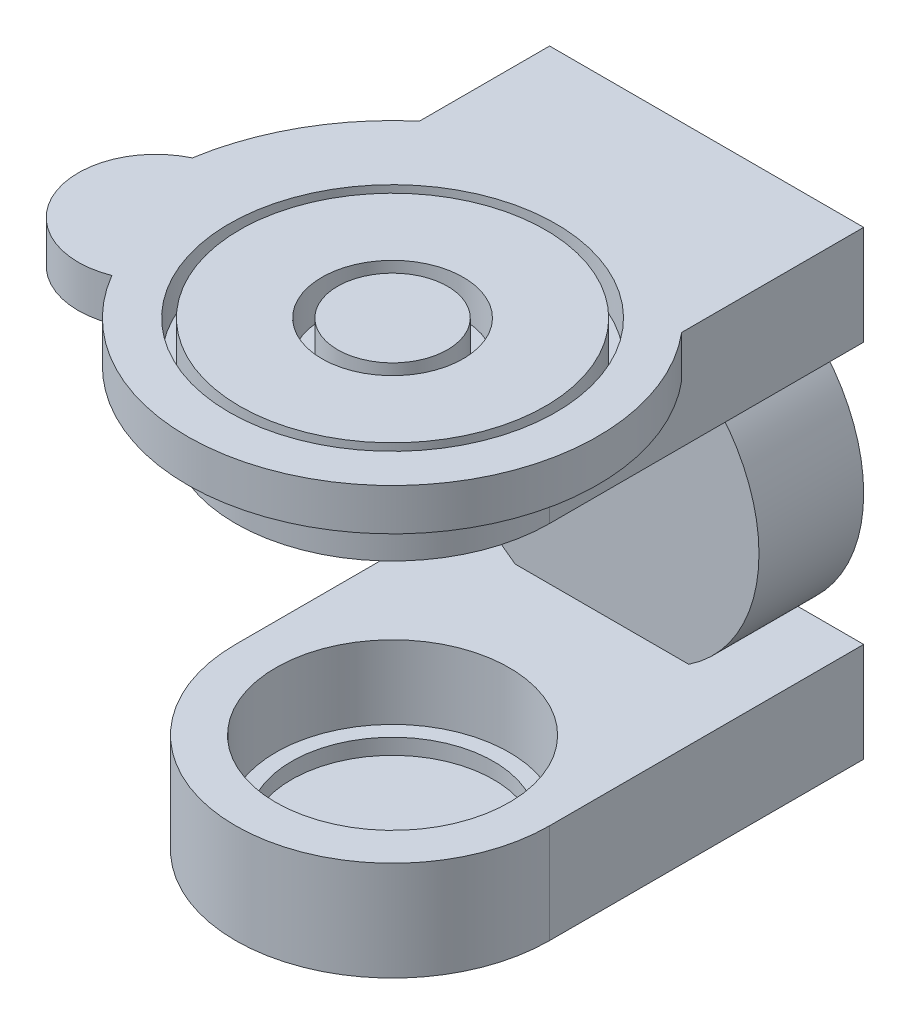
ISO-10303-21;
HEADER;
FILE_DESCRIPTION(('STEP AP214'),'2;1');
FILE_NAME('part.step','',(''),(''),'','','');
FILE_SCHEMA(('AUTOMOTIVE_DESIGN { 1 0 10303 214 1 1 1 1 }'));
ENDSEC;
DATA;
#1=APPLICATION_CONTEXT('core data for automotive mechanical design processes');
#2=APPLICATION_PROTOCOL_DEFINITION('international standard','automotive_design',2000,#1);
#3=PRODUCT_CONTEXT('',#1,'mechanical');
#4=PRODUCT('Part','Part','',(#3));
#5=PRODUCT_RELATED_PRODUCT_CATEGORY('part','',(#4));
#6=PRODUCT_DEFINITION_FORMATION('','',#4);
#7=PRODUCT_DEFINITION_CONTEXT('part definition',#1,'design');
#8=PRODUCT_DEFINITION('design','',#6,#7);
#9=PRODUCT_DEFINITION_SHAPE('','',#8);
#10=(LENGTH_UNIT() NAMED_UNIT(*) SI_UNIT(.MILLI.,.METRE.));
#11=(NAMED_UNIT(*) PLANE_ANGLE_UNIT() SI_UNIT($,.RADIAN.));
#12=(NAMED_UNIT(*) SI_UNIT($,.STERADIAN.) SOLID_ANGLE_UNIT());
#13=UNCERTAINTY_MEASURE_WITH_UNIT(LENGTH_MEASURE(1.E-05),#10,'distance_accuracy_value','');
#14=(GEOMETRIC_REPRESENTATION_CONTEXT(3) GLOBAL_UNCERTAINTY_ASSIGNED_CONTEXT((#13)) GLOBAL_UNIT_ASSIGNED_CONTEXT((#10,
#11,#12)) REPRESENTATION_CONTEXT('',''));
#15=CARTESIAN_POINT('',(0.,0.,0.));
#16=DIRECTION('',(0.,0.,1.));
#17=DIRECTION('',(1.,0.,0.));
#18=AXIS2_PLACEMENT_3D('',#15,#16,#17);
#19=CARTESIAN_POINT('',(-15.,22.,0.));
#20=DIRECTION('',(1.,0.,0.));
#21=DIRECTION('',(0.,0.,-1.));
#22=AXIS2_PLACEMENT_3D('',#19,#20,#21);
#23=PLANE('',#22);
#24=DIRECTION('',(0.,1.,0.));
#25=VECTOR('',#24,1.);
#26=CARTESIAN_POINT('',(-15.,18.,12.4327008336503));
#27=LINE('',#26,#25);
#28=CARTESIAN_POINT('',(-15.,18.,12.4327008336503));
#29=VERTEX_POINT('',#28);
#30=CARTESIAN_POINT('',(-15.,22.,12.4327008336503));
#31=VERTEX_POINT('',#30);
#32=EDGE_CURVE('E211',#29,#31,#27,.T.);
#33=ORIENTED_EDGE('',*,*,#32,.T.);
#34=DIRECTION('',(0.,0.,1.));
#35=VECTOR('',#34,1.);
#36=CARTESIAN_POINT('',(-15.,22.,0.));
#37=LINE('',#36,#35);
#38=CARTESIAN_POINT('',(-15.,22.,0.));
#39=VERTEX_POINT('',#38);
#40=EDGE_CURVE('E251',#39,#31,#37,.T.);
#41=ORIENTED_EDGE('',*,*,#40,.F.);
#42=DIRECTION('',(0.,-1.,0.));
#43=VECTOR('',#42,1.);
#44=CARTESIAN_POINT('',(-15.,22.,0.));
#45=LINE('',#44,#43);
#46=CARTESIAN_POINT('',(-15.,12.5,0.));
#47=VERTEX_POINT('',#46);
#48=EDGE_CURVE('E263',#39,#47,#45,.T.);
#49=ORIENTED_EDGE('',*,*,#48,.T.);
#50=DIRECTION('',(0.,0.,1.));
#51=VECTOR('',#50,1.);
#52=CARTESIAN_POINT('',(-15.,12.5,0.));
#53=LINE('',#52,#51);
#54=CARTESIAN_POINT('',(-15.,12.5,30.));
#55=VERTEX_POINT('',#54);
#56=EDGE_CURVE('E239',#47,#55,#53,.T.);
#57=ORIENTED_EDGE('',*,*,#56,.T.);
#58=DIRECTION('',(0.,-1.,0.));
#59=VECTOR('',#58,1.);
#60=CARTESIAN_POINT('',(-15.,22.,30.));
#61=LINE('',#60,#59);
#62=CARTESIAN_POINT('',(-15.,18.,30.));
#63=VERTEX_POINT('',#62);
#64=EDGE_CURVE('E261',#63,#55,#61,.T.);
#65=ORIENTED_EDGE('',*,*,#64,.F.);
#66=DIRECTION('',(0.,0.,1.));
#67=VECTOR('',#66,1.);
#68=CARTESIAN_POINT('',(-15.,18.,0.));
#69=LINE('',#68,#67);
#70=EDGE_CURVE('E95',#29,#63,#69,.T.);
#71=ORIENTED_EDGE('',*,*,#70,.F.);
#72=EDGE_LOOP('',(#33,#41,#49,#57,#65,#71));
#73=FACE_BOUND('',#72,.T.);
#74=ADVANCED_FACE('F78',(#73),#23,.F.);
#75=CARTESIAN_POINT('',(0.,22.,30.));
#76=DIRECTION('',(0.,-1.,0.));
#77=DIRECTION('',(0.,0.,-1.));
#78=AXIS2_PLACEMENT_3D('',#75,#76,#77);
#79=CYLINDRICAL_SURFACE('',#78,15.);
#80=CARTESIAN_POINT('',(0.,18.,30.));
#81=DIRECTION('',(0.,1.,0.));
#82=DIRECTION('',(0.,0.,1.));
#83=AXIS2_PLACEMENT_3D('',#80,#81,#82);
#84=CIRCLE('',#83,15.);
#85=CARTESIAN_POINT('',(15.,18.,30.));
#86=VERTEX_POINT('',#85);
#87=EDGE_CURVE('E231',#63,#86,#84,.T.);
#88=ORIENTED_EDGE('',*,*,#87,.F.);
#89=ORIENTED_EDGE('',*,*,#64,.T.);
#90=CARTESIAN_POINT('',(0.,12.5,30.));
#91=DIRECTION('',(0.,-1.,0.));
#92=DIRECTION('',(0.,0.,-1.));
#93=AXIS2_PLACEMENT_3D('',#90,#91,#92);
#94=CIRCLE('',#93,15.);
#95=CARTESIAN_POINT('',(15.,12.5,30.));
#96=VERTEX_POINT('',#95);
#97=EDGE_CURVE('E242',#55,#96,#94,.F.);
#98=ORIENTED_EDGE('',*,*,#97,.T.);
#99=DIRECTION('',(0.,-1.,0.));
#100=VECTOR('',#99,1.);
#101=CARTESIAN_POINT('',(15.,22.,30.));
#102=LINE('',#101,#100);
#103=EDGE_CURVE('E259',#86,#96,#102,.T.);
#104=ORIENTED_EDGE('',*,*,#103,.F.);
#105=EDGE_LOOP('',(#88,#89,#98,#104));
#106=FACE_BOUND('',#105,.T.);
#107=ADVANCED_FACE('F374',(#106),#79,.T.);
#108=CARTESIAN_POINT('',(15.,22.,0.));
#109=DIRECTION('',(1.,0.,0.));
#110=DIRECTION('',(0.,0.,-1.));
#111=AXIS2_PLACEMENT_3D('',#108,#109,#110);
#112=PLANE('',#111);
#113=DIRECTION('',(0.,0.,1.));
#114=VECTOR('',#113,1.);
#115=CARTESIAN_POINT('',(15.,22.,0.));
#116=LINE('',#115,#114);
#117=CARTESIAN_POINT('',(15.,22.,0.));
#118=VERTEX_POINT('',#117);
#119=CARTESIAN_POINT('',(15.,22.,17.3841369696719));
#120=VERTEX_POINT('',#119);
#121=EDGE_CURVE('E254',#118,#120,#116,.T.);
#122=ORIENTED_EDGE('',*,*,#121,.T.);
#123=DIRECTION('',(0.,1.,0.));
#124=VECTOR('',#123,1.);
#125=CARTESIAN_POINT('',(15.,18.,17.3841369696719));
#126=LINE('',#125,#124);
#127=CARTESIAN_POINT('',(15.,18.,17.3841369696719));
#128=VERTEX_POINT('',#127);
#129=EDGE_CURVE('E201',#128,#120,#126,.T.);
#130=ORIENTED_EDGE('',*,*,#129,.F.);
#131=DIRECTION('',(0.,0.,1.));
#132=VECTOR('',#131,1.);
#133=CARTESIAN_POINT('',(15.,18.,0.));
#134=LINE('',#133,#132);
#135=EDGE_CURVE('E229',#128,#86,#134,.T.);
#136=ORIENTED_EDGE('',*,*,#135,.T.);
#137=ORIENTED_EDGE('',*,*,#103,.T.);
#138=DIRECTION('',(0.,0.,1.));
#139=VECTOR('',#138,1.);
#140=CARTESIAN_POINT('',(15.,12.5,0.));
#141=LINE('',#140,#139);
#142=CARTESIAN_POINT('',(15.,12.5,0.));
#143=VERTEX_POINT('',#142);
#144=EDGE_CURVE('E245',#143,#96,#141,.T.);
#145=ORIENTED_EDGE('',*,*,#144,.F.);
#146=DIRECTION('',(0.,-1.,0.));
#147=VECTOR('',#146,1.);
#148=CARTESIAN_POINT('',(15.,22.,0.));
#149=LINE('',#148,#147);
#150=EDGE_CURVE('E256',#118,#143,#149,.T.);
#151=ORIENTED_EDGE('',*,*,#150,.F.);
#152=EDGE_LOOP('',(#122,#130,#136,#137,#145,#151));
#153=FACE_BOUND('',#152,.T.);
#154=ADVANCED_FACE('F379',(#153),#112,.T.);
#155=CARTESIAN_POINT('',(0.,19.5,30.));
#156=DIRECTION('',(0.,-1.,0.));
#157=DIRECTION('',(0.,0.,-1.));
#158=AXIS2_PLACEMENT_3D('',#155,#156,#157);
#159=CYLINDRICAL_SURFACE('',#158,11.15);
#160=CARTESIAN_POINT('',(0.,12.5,30.));
#161=DIRECTION('',(0.,1.,0.));
#162=DIRECTION('',(0.,0.,1.));
#163=AXIS2_PLACEMENT_3D('',#160,#161,#162);
#164=CIRCLE('',#163,11.15);
#165=CARTESIAN_POINT('',(0.,12.5,41.15));
#166=VERTEX_POINT('',#165);
#167=EDGE_CURVE('E233',#166,#166,#164,.T.);
#168=ORIENTED_EDGE('',*,*,#167,.F.);
#169=EDGE_LOOP('',(#168));
#170=FACE_BOUND('',#169,.T.);
#171=CARTESIAN_POINT('',(0.,18.,30.));
#172=DIRECTION('',(0.,1.,0.));
#173=DIRECTION('',(0.,0.,1.));
#174=AXIS2_PLACEMENT_3D('',#171,#172,#173);
#175=CIRCLE('',#174,11.15);
#176=CARTESIAN_POINT('',(0.,18.,41.15));
#177=VERTEX_POINT('',#176);
#178=EDGE_CURVE('E82',#177,#177,#175,.T.);
#179=ORIENTED_EDGE('',*,*,#178,.T.);
#180=EDGE_LOOP('',(#179));
#181=FACE_BOUND('',#180,.T.);
#182=ADVANCED_FACE('F656',(#170,#181),#159,.F.);
#183=CARTESIAN_POINT('',(0.,0.,10.));
#184=DIRECTION('',(0.,0.,-1.));
#185=DIRECTION('',(-1.,0.,0.));
#186=AXIS2_PLACEMENT_3D('',#183,#184,#185);
#187=CYLINDRICAL_SURFACE('',#186,15.);
#188=DIRECTION('',(0.,0.,-1.));
#189=VECTOR('',#188,1.);
#190=CARTESIAN_POINT('',(8.2915619758885,12.5,10.));
#191=LINE('',#190,#189);
#192=CARTESIAN_POINT('',(8.2915619758885,12.5,10.));
#193=VERTEX_POINT('',#192);
#194=CARTESIAN_POINT('',(8.2915619758885,12.5,0.));
#195=VERTEX_POINT('',#194);
#196=EDGE_CURVE('E270',#193,#195,#191,.T.);
#197=ORIENTED_EDGE('',*,*,#196,.F.);
#198=CARTESIAN_POINT('',(0.,0.,10.));
#199=DIRECTION('',(0.,0.,1.));
#200=DIRECTION('',(1.,0.,0.));
#201=AXIS2_PLACEMENT_3D('',#198,#199,#200);
#202=CIRCLE('',#201,15.);
#203=CARTESIAN_POINT('',(8.2915619758885,-12.5,10.));
#204=VERTEX_POINT('',#203);
#205=EDGE_CURVE('E12',#204,#193,#202,.T.);
#206=ORIENTED_EDGE('',*,*,#205,.F.);
#207=DIRECTION('',(0.,0.,-1.));
#208=VECTOR('',#207,1.);
#209=CARTESIAN_POINT('',(8.2915619758885,-12.5,10.));
#210=LINE('',#209,#208);
#211=CARTESIAN_POINT('',(8.2915619758885,-12.5,0.));
#212=VERTEX_POINT('',#211);
#213=EDGE_CURVE('E320',#212,#204,#210,.F.);
#214=ORIENTED_EDGE('',*,*,#213,.F.);
#215=CARTESIAN_POINT('',(0.,0.,0.));
#216=DIRECTION('',(0.,0.,1.));
#217=DIRECTION('',(1.,0.,0.));
#218=AXIS2_PLACEMENT_3D('',#215,#216,#217);
#219=CIRCLE('',#218,15.);
#220=EDGE_CURVE('E325',#212,#195,#219,.T.);
#221=ORIENTED_EDGE('',*,*,#220,.T.);
#222=EDGE_LOOP('',(#197,#206,#214,#221));
#223=FACE_BOUND('',#222,.T.);
#224=ADVANCED_FACE('F80',(#223),#187,.T.);
#225=DIRECTION('',(0.,0.,-1.));
#226=VECTOR('',#225,1.);
#227=CARTESIAN_POINT('',(-8.2915619758885,12.5,10.));
#228=LINE('',#227,#226);
#229=CARTESIAN_POINT('',(-8.2915619758885,12.5,0.));
#230=VERTEX_POINT('',#229);
#231=CARTESIAN_POINT('',(-8.2915619758885,12.5,10.));
#232=VERTEX_POINT('',#231);
#233=EDGE_CURVE('E268',#230,#232,#228,.F.);
#234=ORIENTED_EDGE('',*,*,#233,.F.);
#235=CARTESIAN_POINT('',(-8.2915619758885,-12.5,0.));
#236=VERTEX_POINT('',#235);
#237=EDGE_CURVE('E324',#230,#236,#219,.T.);
#238=ORIENTED_EDGE('',*,*,#237,.T.);
#239=DIRECTION('',(0.,0.,-1.));
#240=VECTOR('',#239,1.);
#241=CARTESIAN_POINT('',(-8.2915619758885,-12.5,10.));
#242=LINE('',#241,#240);
#243=CARTESIAN_POINT('',(-8.2915619758885,-12.5,10.));
#244=VERTEX_POINT('',#243);
#245=EDGE_CURVE('E322',#244,#236,#242,.T.);
#246=ORIENTED_EDGE('',*,*,#245,.F.);
#247=EDGE_CURVE('E87',#232,#244,#202,.T.);
#248=ORIENTED_EDGE('',*,*,#247,.F.);
#249=EDGE_LOOP('',(#234,#238,#246,#248));
#250=FACE_BOUND('',#249,.T.);
#251=ADVANCED_FACE('F335',(#250),#187,.T.);
#252=CARTESIAN_POINT('',(0.,0.,10.));
#253=DIRECTION('',(0.,0.,1.));
#254=DIRECTION('',(1.,0.,0.));
#255=AXIS2_PLACEMENT_3D('',#252,#253,#254);
#256=PLANE('',#255);
#257=ORIENTED_EDGE('',*,*,#205,.T.);
#258=DIRECTION('',(-1.,0.,0.));
#259=VECTOR('',#258,1.);
#260=CARTESIAN_POINT('',(0.,12.5,10.));
#261=LINE('',#260,#259);
#262=EDGE_CURVE('E265',#193,#232,#261,.T.);
#263=ORIENTED_EDGE('',*,*,#262,.T.);
#264=ORIENTED_EDGE('',*,*,#247,.T.);
#265=DIRECTION('',(1.,0.,0.));
#266=VECTOR('',#265,1.);
#267=CARTESIAN_POINT('',(0.,-12.5,10.));
#268=LINE('',#267,#266);
#269=EDGE_CURVE('E317',#244,#204,#268,.T.);
#270=ORIENTED_EDGE('',*,*,#269,.T.);
#271=EDGE_LOOP('',(#257,#263,#264,#270));
#272=FACE_BOUND('',#271,.T.);
#273=ADVANCED_FACE('F365',(#272),#256,.T.);
#274=CARTESIAN_POINT('',(0.,0.,0.));
#275=DIRECTION('',(0.,0.,1.));
#276=DIRECTION('',(1.,0.,0.));
#277=AXIS2_PLACEMENT_3D('',#274,#275,#276);
#278=PLANE('',#277);
#279=ORIENTED_EDGE('',*,*,#237,.F.);
#280=DIRECTION('',(1.,0.,0.));
#281=VECTOR('',#280,1.);
#282=CARTESIAN_POINT('',(0.,12.5,0.));
#283=LINE('',#282,#281);
#284=EDGE_CURVE('E237',#47,#230,#283,.T.);
#285=ORIENTED_EDGE('',*,*,#284,.F.);
#286=ORIENTED_EDGE('',*,*,#48,.F.);
#287=DIRECTION('',(1.,0.,0.));
#288=VECTOR('',#287,1.);
#289=CARTESIAN_POINT('',(0.,22.,0.));
#290=LINE('',#289,#288);
#291=EDGE_CURVE('E248',#39,#118,#290,.T.);
#292=ORIENTED_EDGE('',*,*,#291,.T.);
#293=ORIENTED_EDGE('',*,*,#150,.T.);
#294=EDGE_CURVE('E236',#195,#143,#283,.T.);
#295=ORIENTED_EDGE('',*,*,#294,.F.);
#296=ORIENTED_EDGE('',*,*,#220,.F.);
#297=DIRECTION('',(1.,0.,0.));
#298=VECTOR('',#297,1.);
#299=CARTESIAN_POINT('',(0.,-12.5,0.));
#300=LINE('',#299,#298);
#301=CARTESIAN_POINT('',(15.,-12.5,0.));
#302=VERTEX_POINT('',#301);
#303=EDGE_CURVE('E284',#212,#302,#300,.T.);
#304=ORIENTED_EDGE('',*,*,#303,.T.);
#305=DIRECTION('',(0.,1.,0.));
#306=VECTOR('',#305,1.);
#307=CARTESIAN_POINT('',(15.,-22.,0.));
#308=LINE('',#307,#306);
#309=CARTESIAN_POINT('',(15.,-22.,0.));
#310=VERTEX_POINT('',#309);
#311=EDGE_CURVE('E314',#310,#302,#308,.T.);
#312=ORIENTED_EDGE('',*,*,#311,.F.);
#313=DIRECTION('',(1.,0.,0.));
#314=VECTOR('',#313,1.);
#315=CARTESIAN_POINT('',(0.,-22.,0.));
#316=LINE('',#315,#314);
#317=CARTESIAN_POINT('',(-15.,-22.,0.));
#318=VERTEX_POINT('',#317);
#319=EDGE_CURVE('E297',#318,#310,#316,.T.);
#320=ORIENTED_EDGE('',*,*,#319,.F.);
#321=DIRECTION('',(0.,1.,0.));
#322=VECTOR('',#321,1.);
#323=CARTESIAN_POINT('',(-15.,-22.,0.));
#324=LINE('',#323,#322);
#325=CARTESIAN_POINT('',(-15.,-12.5,0.));
#326=VERTEX_POINT('',#325);
#327=EDGE_CURVE('E308',#318,#326,#324,.T.);
#328=ORIENTED_EDGE('',*,*,#327,.T.);
#329=EDGE_CURVE('E285',#326,#236,#300,.T.);
#330=ORIENTED_EDGE('',*,*,#329,.T.);
#331=EDGE_LOOP('',(#279,#285,#286,#292,#293,#295,#296,#304,#312,#320,#328,#330));
#332=FACE_BOUND('',#331,.T.);
#333=ADVANCED_FACE('F343',(#332),#278,.F.);
#334=CARTESIAN_POINT('',(0.,-12.5,0.));
#335=DIRECTION('',(0.,-1.,0.));
#336=DIRECTION('',(0.,0.,-1.));
#337=AXIS2_PLACEMENT_3D('',#334,#335,#336);
#338=PLANE('',#337);
#339=CARTESIAN_POINT('',(0.,-12.5,30.));
#340=DIRECTION('',(0.,1.,0.));
#341=DIRECTION('',(0.,0.,1.));
#342=AXIS2_PLACEMENT_3D('',#339,#340,#341);
#343=CIRCLE('',#342,11.15);
#344=CARTESIAN_POINT('',(0.,-12.5,41.15));
#345=VERTEX_POINT('',#344);
#346=EDGE_CURVE('E272',#345,#345,#343,.T.);
#347=ORIENTED_EDGE('',*,*,#346,.F.);
#348=EDGE_LOOP('',(#347));
#349=FACE_BOUND('',#348,.T.);
#350=ORIENTED_EDGE('',*,*,#269,.F.);
#351=ORIENTED_EDGE('',*,*,#245,.T.);
#352=ORIENTED_EDGE('',*,*,#329,.F.);
#353=DIRECTION('',(0.,0.,1.));
#354=VECTOR('',#353,1.);
#355=CARTESIAN_POINT('',(-15.,-12.5,0.));
#356=LINE('',#355,#354);
#357=CARTESIAN_POINT('',(-15.,-12.5,30.));
#358=VERTEX_POINT('',#357);
#359=EDGE_CURVE('E294',#326,#358,#356,.T.);
#360=ORIENTED_EDGE('',*,*,#359,.T.);
#361=CARTESIAN_POINT('',(0.,-12.5,30.));
#362=DIRECTION('',(0.,-1.,0.));
#363=DIRECTION('',(0.,0.,-1.));
#364=AXIS2_PLACEMENT_3D('',#361,#362,#363);
#365=CIRCLE('',#364,15.);
#366=CARTESIAN_POINT('',(15.,-12.5,30.));
#367=VERTEX_POINT('',#366);
#368=EDGE_CURVE('E291',#358,#367,#365,.F.);
#369=ORIENTED_EDGE('',*,*,#368,.T.);
#370=DIRECTION('',(0.,0.,1.));
#371=VECTOR('',#370,1.);
#372=CARTESIAN_POINT('',(15.,-12.5,0.));
#373=LINE('',#372,#371);
#374=EDGE_CURVE('E288',#302,#367,#373,.T.);
#375=ORIENTED_EDGE('',*,*,#374,.F.);
#376=ORIENTED_EDGE('',*,*,#303,.F.);
#377=ORIENTED_EDGE('',*,*,#213,.T.);
#378=EDGE_LOOP('',(#350,#351,#352,#360,#369,#375,#376,#377));
#379=FACE_BOUND('',#378,.T.);
#380=ADVANCED_FACE('F342',(#349,#379),#338,.F.);
#381=CARTESIAN_POINT('',(15.,-22.,0.));
#382=DIRECTION('',(-1.,0.,0.));
#383=DIRECTION('',(0.,0.,1.));
#384=AXIS2_PLACEMENT_3D('',#381,#382,#383);
#385=PLANE('',#384);
#386=ORIENTED_EDGE('',*,*,#311,.T.);
#387=ORIENTED_EDGE('',*,*,#374,.T.);
#388=DIRECTION('',(0.,1.,0.));
#389=VECTOR('',#388,1.);
#390=CARTESIAN_POINT('',(15.,-22.,30.));
#391=LINE('',#390,#389);
#392=CARTESIAN_POINT('',(15.,-22.,30.));
#393=VERTEX_POINT('',#392);
#394=EDGE_CURVE('E312',#393,#367,#391,.T.);
#395=ORIENTED_EDGE('',*,*,#394,.F.);
#396=DIRECTION('',(0.,0.,1.));
#397=VECTOR('',#396,1.);
#398=CARTESIAN_POINT('',(15.,-22.,0.));
#399=LINE('',#398,#397);
#400=EDGE_CURVE('E300',#310,#393,#399,.T.);
#401=ORIENTED_EDGE('',*,*,#400,.F.);
#402=EDGE_LOOP('',(#386,#387,#395,#401));
#403=FACE_BOUND('',#402,.T.);
#404=ADVANCED_FACE('F357',(#403),#385,.F.);
#405=CARTESIAN_POINT('',(0.,-22.,30.));
#406=DIRECTION('',(0.,1.,0.));
#407=DIRECTION('',(0.,0.,1.));
#408=AXIS2_PLACEMENT_3D('',#405,#406,#407);
#409=CYLINDRICAL_SURFACE('',#408,15.);
#410=ORIENTED_EDGE('',*,*,#394,.T.);
#411=ORIENTED_EDGE('',*,*,#368,.F.);
#412=DIRECTION('',(0.,1.,0.));
#413=VECTOR('',#412,1.);
#414=CARTESIAN_POINT('',(-15.,-22.,30.));
#415=LINE('',#414,#413);
#416=CARTESIAN_POINT('',(-15.,-22.,30.));
#417=VERTEX_POINT('',#416);
#418=EDGE_CURVE('E310',#417,#358,#415,.T.);
#419=ORIENTED_EDGE('',*,*,#418,.F.);
#420=CARTESIAN_POINT('',(0.,-22.,30.));
#421=DIRECTION('',(0.,-1.,0.));
#422=DIRECTION('',(0.,0.,-1.));
#423=AXIS2_PLACEMENT_3D('',#420,#421,#422);
#424=CIRCLE('',#423,15.);
#425=EDGE_CURVE('E302',#417,#393,#424,.F.);
#426=ORIENTED_EDGE('',*,*,#425,.T.);
#427=EDGE_LOOP('',(#410,#411,#419,#426));
#428=FACE_BOUND('',#427,.T.);
#429=ADVANCED_FACE('F353',(#428),#409,.T.);
#430=CARTESIAN_POINT('',(-15.,-22.,0.));
#431=DIRECTION('',(-1.,0.,0.));
#432=DIRECTION('',(0.,0.,1.));
#433=AXIS2_PLACEMENT_3D('',#430,#431,#432);
#434=PLANE('',#433);
#435=ORIENTED_EDGE('',*,*,#418,.T.);
#436=ORIENTED_EDGE('',*,*,#359,.F.);
#437=ORIENTED_EDGE('',*,*,#327,.F.);
#438=DIRECTION('',(0.,0.,1.));
#439=VECTOR('',#438,1.);
#440=CARTESIAN_POINT('',(-15.,-22.,0.));
#441=LINE('',#440,#439);
#442=EDGE_CURVE('E305',#318,#417,#441,.T.);
#443=ORIENTED_EDGE('',*,*,#442,.T.);
#444=EDGE_LOOP('',(#435,#436,#437,#443));
#445=FACE_BOUND('',#444,.T.);
#446=ADVANCED_FACE('F349',(#445),#434,.T.);
#447=CARTESIAN_POINT('',(0.,-22.,0.));
#448=DIRECTION('',(0.,-1.,0.));
#449=DIRECTION('',(0.,0.,-1.));
#450=AXIS2_PLACEMENT_3D('',#447,#448,#449);
#451=PLANE('',#450);
#452=ORIENTED_EDGE('',*,*,#319,.T.);
#453=ORIENTED_EDGE('',*,*,#400,.T.);
#454=ORIENTED_EDGE('',*,*,#425,.F.);
#455=ORIENTED_EDGE('',*,*,#442,.F.);
#456=EDGE_LOOP('',(#452,#453,#454,#455));
#457=FACE_BOUND('',#456,.T.);
#458=ADVANCED_FACE('F392',(#457),#451,.T.);
#459=CARTESIAN_POINT('',(0.,-19.5,30.));
#460=DIRECTION('',(0.,1.,0.));
#461=DIRECTION('',(0.,0.,1.));
#462=AXIS2_PLACEMENT_3D('',#459,#460,#461);
#463=CYLINDRICAL_SURFACE('',#462,11.15);
#464=CARTESIAN_POINT('',(0.,-19.5,30.));
#465=DIRECTION('',(0.,1.,0.));
#466=DIRECTION('',(0.,0.,1.));
#467=AXIS2_PLACEMENT_3D('',#464,#465,#466);
#468=CIRCLE('',#467,11.15);
#469=CARTESIAN_POINT('',(0.,-19.5,41.15));
#470=VERTEX_POINT('',#469);
#471=EDGE_CURVE('E276',#470,#470,#468,.T.);
#472=ORIENTED_EDGE('',*,*,#471,.F.);
#473=EDGE_LOOP('',(#472));
#474=FACE_BOUND('',#473,.T.);
#475=ORIENTED_EDGE('',*,*,#346,.T.);
#476=EDGE_LOOP('',(#475));
#477=FACE_BOUND('',#476,.T.);
#478=ADVANCED_FACE('F388',(#474,#477),#463,.F.);
#479=CARTESIAN_POINT('',(0.,-19.5,0.));
#480=DIRECTION('',(0.,1.,0.));
#481=DIRECTION('',(0.,0.,1.));
#482=AXIS2_PLACEMENT_3D('',#479,#480,#481);
#483=PLANE('',#482);
#484=CARTESIAN_POINT('',(0.,-19.5,30.));
#485=DIRECTION('',(0.,1.,0.));
#486=DIRECTION('',(0.,0.,1.));
#487=AXIS2_PLACEMENT_3D('',#484,#485,#486);
#488=CIRCLE('',#487,9.65);
#489=CARTESIAN_POINT('',(0.,-19.5,39.65));
#490=VERTEX_POINT('',#489);
#491=EDGE_CURVE('E273',#490,#490,#488,.T.);
#492=ORIENTED_EDGE('',*,*,#491,.F.);
#493=EDGE_LOOP('',(#492));
#494=FACE_BOUND('',#493,.T.);
#495=ORIENTED_EDGE('',*,*,#471,.T.);
#496=EDGE_LOOP('',(#495));
#497=FACE_BOUND('',#496,.T.);
#498=ADVANCED_FACE('F384',(#494,#497),#483,.T.);
#499=CARTESIAN_POINT('',(0.,-21.,0.));
#500=DIRECTION('',(0.,1.,0.));
#501=DIRECTION('',(0.,0.,1.));
#502=AXIS2_PLACEMENT_3D('',#499,#500,#501);
#503=PLANE('',#502);
#504=CARTESIAN_POINT('',(0.,-21.,30.));
#505=DIRECTION('',(0.,1.,0.));
#506=DIRECTION('',(0.,0.,1.));
#507=AXIS2_PLACEMENT_3D('',#504,#505,#506);
#508=CIRCLE('',#507,9.65);
#509=CARTESIAN_POINT('',(0.,-21.,39.65));
#510=VERTEX_POINT('',#509);
#511=EDGE_CURVE('E279',#510,#510,#508,.T.);
#512=ORIENTED_EDGE('',*,*,#511,.T.);
#513=EDGE_LOOP('',(#512));
#514=FACE_BOUND('',#513,.T.);
#515=ADVANCED_FACE('F387',(#514),#503,.T.);
#516=CARTESIAN_POINT('',(0.,-21.,30.));
#517=DIRECTION('',(0.,1.,0.));
#518=DIRECTION('',(0.,0.,1.));
#519=AXIS2_PLACEMENT_3D('',#516,#517,#518);
#520=CYLINDRICAL_SURFACE('',#519,9.65);
#521=ORIENTED_EDGE('',*,*,#511,.F.);
#522=EDGE_LOOP('',(#521));
#523=FACE_BOUND('',#522,.T.);
#524=ORIENTED_EDGE('',*,*,#491,.T.);
#525=EDGE_LOOP('',(#524));
#526=FACE_BOUND('',#525,.T.);
#527=ADVANCED_FACE('F396',(#523,#526),#520,.F.);
#528=CARTESIAN_POINT('',(0.,12.5,0.));
#529=DIRECTION('',(0.,1.,0.));
#530=DIRECTION('',(0.,0.,-1.));
#531=AXIS2_PLACEMENT_3D('',#528,#529,#530);
#532=PLANE('',#531);
#533=ORIENTED_EDGE('',*,*,#167,.T.);
#534=EDGE_LOOP('',(#533));
#535=FACE_BOUND('',#534,.T.);
#536=ORIENTED_EDGE('',*,*,#262,.F.);
#537=ORIENTED_EDGE('',*,*,#196,.T.);
#538=ORIENTED_EDGE('',*,*,#294,.T.);
#539=ORIENTED_EDGE('',*,*,#144,.T.);
#540=ORIENTED_EDGE('',*,*,#97,.F.);
#541=ORIENTED_EDGE('',*,*,#56,.F.);
#542=ORIENTED_EDGE('',*,*,#284,.T.);
#543=ORIENTED_EDGE('',*,*,#233,.T.);
#544=EDGE_LOOP('',(#536,#537,#538,#539,#540,#541,#542,#543));
#545=FACE_BOUND('',#544,.T.);
#546=ADVANCED_FACE('F362',(#535,#545),#532,.F.);
#547=CARTESIAN_POINT('',(0.,22.,0.));
#548=DIRECTION('',(0.,1.,0.));
#549=DIRECTION('',(0.,0.,-1.));
#550=AXIS2_PLACEMENT_3D('',#547,#548,#549);
#551=PLANE('',#550);
#552=CARTESIAN_POINT('',(0.,22.,30.));
#553=DIRECTION('',(0.,1.,0.));
#554=DIRECTION('',(0.,0.,1.));
#555=AXIS2_PLACEMENT_3D('',#552,#553,#554);
#556=CIRCLE('',#555,15.6);
#557=CARTESIAN_POINT('',(0.,22.,45.6));
#558=VERTEX_POINT('',#557);
#559=EDGE_CURVE('E757',#558,#558,#556,.T.);
#560=ORIENTED_EDGE('',*,*,#559,.F.);
#561=EDGE_LOOP('',(#560));
#562=FACE_BOUND('',#561,.T.);
#563=ORIENTED_EDGE('',*,*,#40,.T.);
#564=CARTESIAN_POINT('',(3.05311331771918E-13,22.,29.9999999999998));
#565=DIRECTION('',(0.,1.,0.));
#566=DIRECTION('',(0.,0.,1.));
#567=AXIS2_PLACEMENT_3D('',#564,#565,#566);
#568=CIRCLE('',#567,23.1000000000007);
#569=CARTESIAN_POINT('',(-22.8049107583976,22.,26.3195047477896));
#570=VERTEX_POINT('',#569);
#571=EDGE_CURVE('E221',#570,#31,#568,.F.);
#572=ORIENTED_EDGE('',*,*,#571,.F.);
#573=CARTESIAN_POINT('',(-19.621990215063,22.,33.0000000000009));
#574=DIRECTION('',(0.,1.,0.));
#575=DIRECTION('',(0.,0.,1.));
#576=AXIS2_PLACEMENT_3D('',#573,#574,#575);
#577=CIRCLE('',#576,7.39999999999997);
#578=CARTESIAN_POINT('',(-16.9219219751436,22.,39.8898208612264));
#579=VERTEX_POINT('',#578);
#580=EDGE_CURVE('E206',#579,#570,#577,.F.);
#581=ORIENTED_EDGE('',*,*,#580,.F.);
#582=CARTESIAN_POINT('',(0.,22.,30.));
#583=DIRECTION('',(0.,1.,0.));
#584=DIRECTION('',(0.,0.,1.));
#585=AXIS2_PLACEMENT_3D('',#582,#583,#584);
#586=CIRCLE('',#585,19.6);
#587=EDGE_CURVE('E218',#120,#579,#586,.F.);
#588=ORIENTED_EDGE('',*,*,#587,.F.);
#589=ORIENTED_EDGE('',*,*,#121,.F.);
#590=ORIENTED_EDGE('',*,*,#291,.F.);
#591=EDGE_LOOP('',(#563,#572,#581,#588,#589,#590));
#592=FACE_BOUND('',#591,.T.);
#593=ADVANCED_FACE('F450',(#562,#592),#551,.T.);
#594=CARTESIAN_POINT('',(0.,18.,0.));
#595=DIRECTION('',(0.,1.,0.));
#596=DIRECTION('',(0.,0.,1.));
#597=AXIS2_PLACEMENT_3D('',#594,#595,#596);
#598=PLANE('',#597);
#599=ORIENTED_EDGE('',*,*,#178,.F.);
#600=EDGE_LOOP('',(#599));
#601=FACE_BOUND('',#600,.T.);
#602=ADVANCED_FACE('F459',(#601),#598,.F.);
#603=CARTESIAN_POINT('',(0.,18.,30.));
#604=DIRECTION('',(0.,1.,0.));
#605=DIRECTION('',(0.,0.,1.));
#606=AXIS2_PLACEMENT_3D('',#603,#604,#605);
#607=CYLINDRICAL_SURFACE('',#606,19.6);
#608=ORIENTED_EDGE('',*,*,#587,.T.);
#609=DIRECTION('',(0.,1.,0.));
#610=VECTOR('',#609,1.);
#611=CARTESIAN_POINT('',(-16.9219219751436,18.,39.8898208612264));
#612=LINE('',#611,#610);
#613=CARTESIAN_POINT('',(-16.9219219751436,18.,39.8898208612264));
#614=VERTEX_POINT('',#613);
#615=EDGE_CURVE('E210',#614,#579,#612,.T.);
#616=ORIENTED_EDGE('',*,*,#615,.F.);
#617=CARTESIAN_POINT('',(0.,18.,30.));
#618=DIRECTION('',(0.,1.,0.));
#619=DIRECTION('',(0.,0.,1.));
#620=AXIS2_PLACEMENT_3D('',#617,#618,#619);
#621=CIRCLE('',#620,19.6);
#622=EDGE_CURVE('E197',#128,#614,#621,.F.);
#623=ORIENTED_EDGE('',*,*,#622,.F.);
#624=ORIENTED_EDGE('',*,*,#129,.T.);
#625=EDGE_LOOP('',(#608,#616,#623,#624));
#626=FACE_BOUND('',#625,.T.);
#627=ADVANCED_FACE('F471',(#626),#607,.T.);
#628=CARTESIAN_POINT('',(-19.621990215063,18.,33.0000000000009));
#629=DIRECTION('',(0.,1.,0.));
#630=DIRECTION('',(0.,0.,1.));
#631=AXIS2_PLACEMENT_3D('',#628,#629,#630);
#632=CYLINDRICAL_SURFACE('',#631,7.39999999999997);
#633=ORIENTED_EDGE('',*,*,#580,.T.);
#634=DIRECTION('',(0.,1.,0.));
#635=VECTOR('',#634,1.);
#636=CARTESIAN_POINT('',(-22.8049107583976,18.,26.3195047477896));
#637=LINE('',#636,#635);
#638=CARTESIAN_POINT('',(-22.8049107583976,18.,26.3195047477896));
#639=VERTEX_POINT('',#638);
#640=EDGE_CURVE('E204',#639,#570,#637,.T.);
#641=ORIENTED_EDGE('',*,*,#640,.F.);
#642=CARTESIAN_POINT('',(-19.621990215063,18.,33.0000000000009));
#643=DIRECTION('',(0.,1.,0.));
#644=DIRECTION('',(0.,0.,1.));
#645=AXIS2_PLACEMENT_3D('',#642,#643,#644);
#646=CIRCLE('',#645,7.39999999999997);
#647=EDGE_CURVE('E190',#614,#639,#646,.F.);
#648=ORIENTED_EDGE('',*,*,#647,.F.);
#649=ORIENTED_EDGE('',*,*,#615,.T.);
#650=EDGE_LOOP('',(#633,#641,#648,#649));
#651=FACE_BOUND('',#650,.T.);
#652=ADVANCED_FACE('F205',(#651),#632,.T.);
#653=CARTESIAN_POINT('',(3.05311331771918E-13,18.,29.9999999999998));
#654=DIRECTION('',(0.,1.,0.));
#655=DIRECTION('',(0.,0.,1.));
#656=AXIS2_PLACEMENT_3D('',#653,#654,#655);
#657=CYLINDRICAL_SURFACE('',#656,23.1000000000007);
#658=ORIENTED_EDGE('',*,*,#571,.T.);
#659=ORIENTED_EDGE('',*,*,#32,.F.);
#660=CARTESIAN_POINT('',(3.05311331771918E-13,18.,29.9999999999998));
#661=DIRECTION('',(0.,1.,0.));
#662=DIRECTION('',(0.,0.,1.));
#663=AXIS2_PLACEMENT_3D('',#660,#661,#662);
#664=CIRCLE('',#663,23.1000000000007);
#665=EDGE_CURVE('E194',#639,#29,#664,.F.);
#666=ORIENTED_EDGE('',*,*,#665,.F.);
#667=ORIENTED_EDGE('',*,*,#640,.T.);
#668=EDGE_LOOP('',(#658,#659,#666,#667));
#669=FACE_BOUND('',#668,.T.);
#670=ADVANCED_FACE('F213',(#669),#657,.T.);
#671=ORIENTED_EDGE('',*,*,#70,.T.);
#672=ORIENTED_EDGE('',*,*,#87,.T.);
#673=ORIENTED_EDGE('',*,*,#135,.F.);
#674=ORIENTED_EDGE('',*,*,#622,.T.);
#675=ORIENTED_EDGE('',*,*,#647,.T.);
#676=ORIENTED_EDGE('',*,*,#665,.T.);
#677=EDGE_LOOP('',(#671,#672,#673,#674,#675,#676));
#678=FACE_BOUND('',#677,.T.);
#679=ADVANCED_FACE('F192',(#678),#598,.F.);
#680=CARTESIAN_POINT('',(0.,18.5,30.));
#681=DIRECTION('',(0.,1.,0.));
#682=DIRECTION('',(0.,0.,1.));
#683=AXIS2_PLACEMENT_3D('',#680,#681,#682);
#684=CYLINDRICAL_SURFACE('',#683,15.6);
#685=CARTESIAN_POINT('',(0.,18.5,30.));
#686=DIRECTION('',(0.,1.,0.));
#687=DIRECTION('',(0.,0.,1.));
#688=AXIS2_PLACEMENT_3D('',#685,#686,#687);
#689=CIRCLE('',#688,15.6);
#690=CARTESIAN_POINT('',(0.,18.5,45.6));
#691=VERTEX_POINT('',#690);
#692=EDGE_CURVE('E756',#691,#691,#689,.T.);
#693=ORIENTED_EDGE('',*,*,#692,.F.);
#694=EDGE_LOOP('',(#693));
#695=FACE_BOUND('',#694,.T.);
#696=ORIENTED_EDGE('',*,*,#559,.T.);
#697=EDGE_LOOP('',(#696));
#698=FACE_BOUND('',#697,.T.);
#699=ADVANCED_FACE('F498',(#695,#698),#684,.F.);
#700=CARTESIAN_POINT('',(0.,18.5,30.));
#701=DIRECTION('',(0.,1.,0.));
#702=DIRECTION('',(0.,0.,1.));
#703=AXIS2_PLACEMENT_3D('',#700,#701,#702);
#704=CYLINDRICAL_SURFACE('',#703,14.6);
#705=CARTESIAN_POINT('',(0.,18.5,30.));
#706=DIRECTION('',(0.,1.,0.));
#707=DIRECTION('',(0.,0.,1.));
#708=AXIS2_PLACEMENT_3D('',#705,#706,#707);
#709=CIRCLE('',#708,14.6);
#710=CARTESIAN_POINT('',(0.,18.5,44.6));
#711=VERTEX_POINT('',#710);
#712=EDGE_CURVE('E222',#711,#711,#709,.T.);
#713=ORIENTED_EDGE('',*,*,#712,.T.);
#714=EDGE_LOOP('',(#713));
#715=FACE_BOUND('',#714,.T.);
#716=CARTESIAN_POINT('',(0.,22.,30.));
#717=DIRECTION('',(0.,1.,0.));
#718=DIRECTION('',(0.,0.,1.));
#719=AXIS2_PLACEMENT_3D('',#716,#717,#718);
#720=CIRCLE('',#719,14.6);
#721=CARTESIAN_POINT('',(0.,22.,44.6));
#722=VERTEX_POINT('',#721);
#723=EDGE_CURVE('E753',#722,#722,#720,.T.);
#724=ORIENTED_EDGE('',*,*,#723,.F.);
#725=EDGE_LOOP('',(#724));
#726=FACE_BOUND('',#725,.T.);
#727=ADVANCED_FACE('F503',(#715,#726),#704,.T.);
#728=CARTESIAN_POINT('',(0.,18.5,0.));
#729=DIRECTION('',(0.,1.,0.));
#730=DIRECTION('',(0.,0.,1.));
#731=AXIS2_PLACEMENT_3D('',#728,#729,#730);
#732=PLANE('',#731);
#733=ORIENTED_EDGE('',*,*,#692,.T.);
#734=EDGE_LOOP('',(#733));
#735=FACE_BOUND('',#734,.T.);
#736=ORIENTED_EDGE('',*,*,#712,.F.);
#737=EDGE_LOOP('',(#736));
#738=FACE_BOUND('',#737,.T.);
#739=ADVANCED_FACE('F511',(#735,#738),#732,.T.);
#740=CARTESIAN_POINT('',(0.,22.,30.));
#741=DIRECTION('',(0.,1.,0.));
#742=DIRECTION('',(0.,0.,1.));
#743=AXIS2_PLACEMENT_3D('',#740,#741,#742);
#744=CIRCLE('',#743,6.75);
#745=CARTESIAN_POINT('',(0.,22.,36.75));
#746=VERTEX_POINT('',#745);
#747=EDGE_CURVE('E765',#746,#746,#744,.T.);
#748=ORIENTED_EDGE('',*,*,#747,.F.);
#749=EDGE_LOOP('',(#748));
#750=FACE_BOUND('',#749,.T.);
#751=ORIENTED_EDGE('',*,*,#723,.T.);
#752=EDGE_LOOP('',(#751));
#753=FACE_BOUND('',#752,.T.);
#754=ADVANCED_FACE('F463',(#750,#753),#551,.T.);
#755=CARTESIAN_POINT('',(0.,18.5,30.));
#756=DIRECTION('',(0.,1.,0.));
#757=DIRECTION('',(0.,0.,1.));
#758=AXIS2_PLACEMENT_3D('',#755,#756,#757);
#759=CYLINDRICAL_SURFACE('',#758,5.25);
#760=CARTESIAN_POINT('',(0.,18.5,30.));
#761=DIRECTION('',(0.,1.,0.));
#762=DIRECTION('',(0.,0.,1.));
#763=AXIS2_PLACEMENT_3D('',#760,#761,#762);
#764=CIRCLE('',#763,5.25);
#765=CARTESIAN_POINT('',(0.,18.5,35.25));
#766=VERTEX_POINT('',#765);
#767=EDGE_CURVE('E768',#766,#766,#764,.T.);
#768=ORIENTED_EDGE('',*,*,#767,.T.);
#769=EDGE_LOOP('',(#768));
#770=FACE_BOUND('',#769,.T.);
#771=CARTESIAN_POINT('',(0.,22.,30.));
#772=DIRECTION('',(0.,1.,0.));
#773=DIRECTION('',(0.,0.,1.));
#774=AXIS2_PLACEMENT_3D('',#771,#772,#773);
#775=CIRCLE('',#774,5.25);
#776=CARTESIAN_POINT('',(0.,22.,35.25));
#777=VERTEX_POINT('',#776);
#778=EDGE_CURVE('E769',#777,#777,#775,.T.);
#779=ORIENTED_EDGE('',*,*,#778,.F.);
#780=EDGE_LOOP('',(#779));
#781=FACE_BOUND('',#780,.T.);
#782=ADVANCED_FACE('F526',(#770,#781),#759,.T.);
#783=CARTESIAN_POINT('',(0.,18.5,30.));
#784=DIRECTION('',(0.,1.,0.));
#785=DIRECTION('',(0.,0.,1.));
#786=AXIS2_PLACEMENT_3D('',#783,#784,#785);
#787=CYLINDRICAL_SURFACE('',#786,6.75);
#788=CARTESIAN_POINT('',(0.,18.5,30.));
#789=DIRECTION('',(0.,1.,0.));
#790=DIRECTION('',(0.,0.,1.));
#791=AXIS2_PLACEMENT_3D('',#788,#789,#790);
#792=CIRCLE('',#791,6.75);
#793=CARTESIAN_POINT('',(0.,18.5,36.75));
#794=VERTEX_POINT('',#793);
#795=EDGE_CURVE('E760',#794,#794,#792,.T.);
#796=ORIENTED_EDGE('',*,*,#795,.F.);
#797=EDGE_LOOP('',(#796));
#798=FACE_BOUND('',#797,.T.);
#799=ORIENTED_EDGE('',*,*,#747,.T.);
#800=EDGE_LOOP('',(#799));
#801=FACE_BOUND('',#800,.T.);
#802=ADVANCED_FACE('F533',(#798,#801),#787,.F.);
#803=CARTESIAN_POINT('',(0.,18.5,0.));
#804=DIRECTION('',(0.,1.,0.));
#805=DIRECTION('',(0.,0.,1.));
#806=AXIS2_PLACEMENT_3D('',#803,#804,#805);
#807=PLANE('',#806);
#808=ORIENTED_EDGE('',*,*,#767,.F.);
#809=EDGE_LOOP('',(#808));
#810=FACE_BOUND('',#809,.T.);
#811=ORIENTED_EDGE('',*,*,#795,.T.);
#812=EDGE_LOOP('',(#811));
#813=FACE_BOUND('',#812,.T.);
#814=ADVANCED_FACE('F541',(#810,#813),#807,.T.);
#815=ORIENTED_EDGE('',*,*,#778,.T.);
#816=EDGE_LOOP('',(#815));
#817=FACE_BOUND('',#816,.T.);
#818=ADVANCED_FACE('F462',(#817),#551,.T.);
#819=CLOSED_SHELL('',(#74,#107,#154,#182,#224,#251,#273,#333,#380,#404,#429,#446,#458,#478,#498,
#515,#527,#546,#593,#602,#627,#652,#670,#679,#699,#727,#739,#754,#782,#802,#814,#818));
#820=MANIFOLD_SOLID_BREP('B2',#819);
#821=ADVANCED_BREP_SHAPE_REPRESENTATION('',(#18,#820),#14);
#822=SHAPE_DEFINITION_REPRESENTATION(#9,#821);
ENDSEC;
END-ISO-10303-21;
